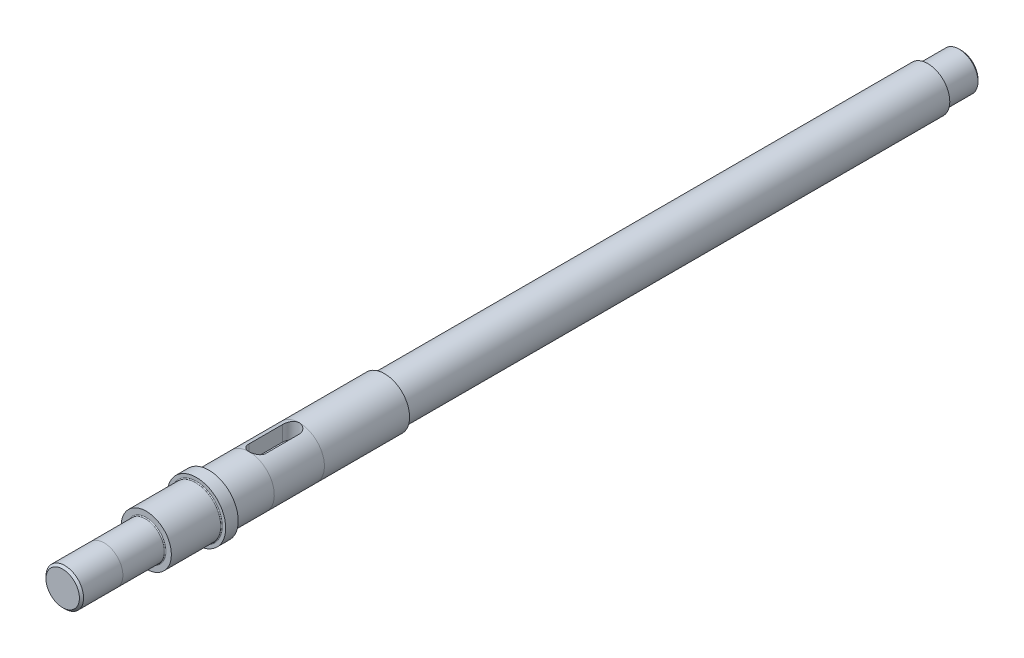
ISO-10303-21;
HEADER;
FILE_DESCRIPTION(('STEP AP214'),'2;1');
FILE_NAME('part.step','',(''),(''),'','','');
FILE_SCHEMA(('AUTOMOTIVE_DESIGN { 1 0 10303 214 1 1 1 1 }'));
ENDSEC;
DATA;
#1=APPLICATION_CONTEXT('core data for automotive mechanical design processes');
#2=APPLICATION_PROTOCOL_DEFINITION('international standard','automotive_design',2000,#1);
#3=PRODUCT_CONTEXT('',#1,'mechanical');
#4=PRODUCT('Part','Part','',(#3));
#5=PRODUCT_RELATED_PRODUCT_CATEGORY('part','',(#4));
#6=PRODUCT_DEFINITION_FORMATION('','',#4);
#7=PRODUCT_DEFINITION_CONTEXT('part definition',#1,'design');
#8=PRODUCT_DEFINITION('design','',#6,#7);
#9=PRODUCT_DEFINITION_SHAPE('','',#8);
#10=(LENGTH_UNIT() NAMED_UNIT(*) SI_UNIT(.MILLI.,.METRE.));
#11=(NAMED_UNIT(*) PLANE_ANGLE_UNIT() SI_UNIT($,.RADIAN.));
#12=(NAMED_UNIT(*) SI_UNIT($,.STERADIAN.) SOLID_ANGLE_UNIT());
#13=UNCERTAINTY_MEASURE_WITH_UNIT(LENGTH_MEASURE(1.E-05),#10,'distance_accuracy_value','');
#14=(GEOMETRIC_REPRESENTATION_CONTEXT(3) GLOBAL_UNCERTAINTY_ASSIGNED_CONTEXT((#13)) GLOBAL_UNIT_ASSIGNED_CONTEXT((#10,
#11,#12)) REPRESENTATION_CONTEXT('',''));
#15=CARTESIAN_POINT('',(0.,0.,0.));
#16=DIRECTION('',(0.,0.,1.));
#17=DIRECTION('',(1.,0.,0.));
#18=AXIS2_PLACEMENT_3D('',#15,#16,#17);
#19=CARTESIAN_POINT('',(0.,0.,172.));
#20=DIRECTION('',(0.,0.,-1.));
#21=DIRECTION('',(-1.,0.,0.));
#22=AXIS2_PLACEMENT_3D('',#19,#20,#21);
#23=CYLINDRICAL_SURFACE('',#22,6.);
#24=CARTESIAN_POINT('',(-2.,5.65685424949238,152.373495065648));
#25=CARTESIAN_POINT('',(-2.0000014949184,5.65684884188678,152.318914072045));
#26=CARTESIAN_POINT('',(-1.99776424917479,5.6576451988649,152.264360941269));
#27=CARTESIAN_POINT('',(-1.9888512140728,5.66078654578442,152.155677897538));
#28=CARTESIAN_POINT('',(-1.98217662286705,5.66313111768244,152.101547874328));
#29=CARTESIAN_POINT('',(-1.95562135046157,5.67238184449302,151.940710779257));
#30=CARTESIAN_POINT('',(-1.92920846605622,5.6815058499903,151.835133373107));
#31=CARTESIAN_POINT('',(-1.85991682366085,5.70456149397718,151.63024468076));
#32=CARTESIAN_POINT('',(-1.81704715197506,5.71849047905859,151.530929971902));
#33=CARTESIAN_POINT('',(-1.71614645792973,5.74957574438921,151.340815397637));
#34=CARTESIAN_POINT('',(-1.65810612564546,5.76673400456217,151.250020807513));
#35=CARTESIAN_POINT('',(-1.52610278704601,5.80308960804095,151.076054602999));
#36=CARTESIAN_POINT('',(-1.45164996064407,5.82233755536618,150.993265304722));
#37=CARTESIAN_POINT('',(-1.28997688598296,5.86027697385956,150.841083030064));
#38=CARTESIAN_POINT('',(-1.20275436910906,5.87896834543706,150.771692439136));
#39=CARTESIAN_POINT('',(-1.01520729191252,5.91427765988455,150.646536028039));
#40=CARTESIAN_POINT('',(-0.914600178716988,5.93082875123708,150.591173096843));
#41=CARTESIAN_POINT('',(-0.704858499931718,5.95939217209316,150.498310562273));
#42=CARTESIAN_POINT('',(-0.595726551186838,5.97140588786619,150.460805502007));
#43=CARTESIAN_POINT('',(-0.37605869095607,5.98918142285845,150.406023613465));
#44=CARTESIAN_POINT('',(-0.265703668920221,5.99514617977147,150.38808852054));
#45=CARTESIAN_POINT('',(-0.0433979389113438,6.00087216807634,150.370862468596));
#46=CARTESIAN_POINT('',(0.0685523824907875,6.00063487762605,150.371567067108));
#47=CARTESIAN_POINT('',(0.286207690558787,5.99412077270532,150.391183631861));
#48=CARTESIAN_POINT('',(0.391985405251075,5.98808121982527,150.409380341567));
#49=CARTESIAN_POINT('',(0.598888128753317,5.97093921001647,150.462281462996));
#50=CARTESIAN_POINT('',(0.700012879232936,5.95983647235462,150.49698679006));
#51=CARTESIAN_POINT('',(0.896305246061934,5.93351336542608,150.582337804849));
#52=CARTESIAN_POINT('',(0.991377011307994,5.91824075676625,150.633187155892));
#53=CARTESIAN_POINT('',(1.17184917819498,5.88516775360088,150.749214968429));
#54=CARTESIAN_POINT('',(1.25724693942937,5.86736667195186,150.814397327741));
#55=CARTESIAN_POINT('',(1.42019467942243,5.83012543885479,150.960837165641));
#56=CARTESIAN_POINT('',(1.4971872232254,5.81064757359828,151.042706152867));
#57=CARTESIAN_POINT('',(1.63654404964076,5.77294980945702,151.21837804508));
#58=CARTESIAN_POINT('',(1.69890360636762,5.75473031831507,151.312184790454));
#59=CARTESIAN_POINT('',(1.80800665118557,5.72140062752635,151.510855422354));
#60=CARTESIAN_POINT('',(1.85450601901537,5.70634029896469,151.615862095514));
#61=CARTESIAN_POINT('',(1.92892046140224,5.68162194124078,151.832789020828));
#62=CARTESIAN_POINT('',(1.95686487211072,5.67195538817986,151.944698052392));
#63=CARTESIAN_POINT('',(1.98331631256166,5.6627308418944,152.110332339144));
#64=CARTESIAN_POINT('',(1.98957012251023,5.66053335389204,152.162777845356));
#65=CARTESIAN_POINT('',(1.99790923214239,5.65759407142798,152.267971222447));
#66=CARTESIAN_POINT('',(1.99999991078996,5.65685039859056,152.320718614736));
#67=CARTESIAN_POINT('',(2.,5.65685424949238,152.373495065648));
#68=B_SPLINE_CURVE_WITH_KNOTS('',3,(#24,#25,#26,#27,#28,#29,#30,#31,#32,#33,#34,#35,#36,#37,#38,
#39,#40,#41,#42,#43,#44,#45,#46,#47,#48,#49,#50,#51,#52,#53,#54,#55,#56,#57,#58,#59,#60,#61,#62,
#63,#64,#65,#66,#67),.UNSPECIFIED.,.F.,.F.,(4,2,2,2,2,2,2,2,2,2,2,2,2,2,2,2,2,2,2,2,2,4),(0.,
0.163636969470881,0.327229772338919,0.653162396790756,0.978915321932496,1.30486862627063,
1.64233009925355,1.97985159727495,2.32618265866202,2.67240782242254,3.00658941454805,
3.34069136061284,3.6616883693147,3.98270317816495,4.30794037651935,4.63326613177537,
4.97388108116099,5.31460588498484,5.66036059856081,6.0055673497368,6.16399790665503,
6.32222363058112),.UNSPECIFIED.);
#69=CARTESIAN_POINT('',(-2.,5.65685424949238,152.373495065648));
#70=VERTEX_POINT('',#69);
#71=CARTESIAN_POINT('',(3.21989888200159E-13,6.00000000000107,150.373495065644));
#72=VERTEX_POINT('',#71);
#73=EDGE_CURVE('E153',#70,#72,#68,.T.);
#74=ORIENTED_EDGE('',*,*,#73,.T.);
#75=CARTESIAN_POINT('',(0.,0.,150.373495065648));
#76=DIRECTION('',(0.,0.,-1.));
#77=DIRECTION('',(-1.,0.,0.));
#78=AXIS2_PLACEMENT_3D('',#75,#76,#77);
#79=CIRCLE('',#78,6.);
#80=EDGE_CURVE('E61',#72,#72,#79,.T.);
#81=ORIENTED_EDGE('',*,*,#80,.F.);
#82=CARTESIAN_POINT('',(2.,5.65685424949238,152.373495065648));
#83=VERTEX_POINT('',#82);
#84=EDGE_CURVE('E152',#72,#83,#68,.T.);
#85=ORIENTED_EDGE('',*,*,#84,.T.);
#86=DIRECTION('',(0.,0.,-1.));
#87=VECTOR('',#86,1.);
#88=CARTESIAN_POINT('',(2.,5.65685424949238,172.));
#89=LINE('',#88,#87);
#90=CARTESIAN_POINT('',(2.,5.65685424949238,160.373495065648));
#91=VERTEX_POINT('',#90);
#92=EDGE_CURVE('E150',#83,#91,#89,.F.);
#93=ORIENTED_EDGE('',*,*,#92,.T.);
#94=CARTESIAN_POINT('',(2.,5.65685424949238,160.373495065648));
#95=CARTESIAN_POINT('',(2.0000014949184,5.65684884188678,160.42807605925));
#96=CARTESIAN_POINT('',(1.99776424917479,5.6576451988649,160.482629190026));
#97=CARTESIAN_POINT('',(1.9888512140728,5.66078654578442,160.591312233757));
#98=CARTESIAN_POINT('',(1.98217662286705,5.66313111768244,160.645442256967));
#99=CARTESIAN_POINT('',(1.95562135046157,5.67238184449302,160.806279352038));
#100=CARTESIAN_POINT('',(1.92920846605622,5.6815058499903,160.911856758189));
#101=CARTESIAN_POINT('',(1.85991682366085,5.70456149397718,161.116745450535));
#102=CARTESIAN_POINT('',(1.81704715197506,5.71849047905859,161.216060159394));
#103=CARTESIAN_POINT('',(1.71614645792973,5.74957574438922,161.406174733659));
#104=CARTESIAN_POINT('',(1.65810612564546,5.76673400456217,161.496969323782));
#105=CARTESIAN_POINT('',(1.52610278704601,5.80308960804095,161.670935528297));
#106=CARTESIAN_POINT('',(1.45164996064407,5.82233755536618,161.753724826573));
#107=CARTESIAN_POINT('',(1.28997688598296,5.86027697385956,161.905907101231));
#108=CARTESIAN_POINT('',(1.20275436910906,5.87896834543706,161.97529769216));
#109=CARTESIAN_POINT('',(1.01520729191251,5.91427765988455,162.100454103256));
#110=CARTESIAN_POINT('',(0.914600178716988,5.93082875123708,162.155817034452));
#111=CARTESIAN_POINT('',(0.704858499931719,5.95939217209317,162.248679569022));
#112=CARTESIAN_POINT('',(0.595726551186838,5.97140588786619,162.286184629289));
#113=CARTESIAN_POINT('',(0.376058690956069,5.98918142285845,162.34096651783));
#114=CARTESIAN_POINT('',(0.265703668920221,5.99514617977147,162.358901610755));
#115=CARTESIAN_POINT('',(0.0433979389113433,6.00087216807634,162.376127662699));
#116=CARTESIAN_POINT('',(-0.0685523824907881,6.00063487762605,162.375423064187));
#117=CARTESIAN_POINT('',(-0.286207690558788,5.99412077270532,162.355806499434));
#118=CARTESIAN_POINT('',(-0.391985405251076,5.98808121982527,162.337609789729));
#119=CARTESIAN_POINT('',(-0.598888128753317,5.97093921001647,162.284708668299));
#120=CARTESIAN_POINT('',(-0.700012879232936,5.95983647235462,162.250003341235));
#121=CARTESIAN_POINT('',(-0.896305246061935,5.93351336542608,162.164652326446));
#122=CARTESIAN_POINT('',(-0.991377011307994,5.91824075676625,162.113802975403));
#123=CARTESIAN_POINT('',(-1.17184917819498,5.88516775360088,161.997775162866));
#124=CARTESIAN_POINT('',(-1.25724693942937,5.86736667195186,161.932592803555));
#125=CARTESIAN_POINT('',(-1.42019467942243,5.83012543885479,161.786152965654));
#126=CARTESIAN_POINT('',(-1.4971872232254,5.81064757359828,161.704283978428));
#127=CARTESIAN_POINT('',(-1.63654404964077,5.77294980945703,161.528612086215));
#128=CARTESIAN_POINT('',(-1.69890360636762,5.75473031831507,161.434805340841));
#129=CARTESIAN_POINT('',(-1.80800665118556,5.72140062752635,161.236134708941));
#130=CARTESIAN_POINT('',(-1.85450601901536,5.70634029896469,161.131128035782));
#131=CARTESIAN_POINT('',(-1.92892046140223,5.68162194124078,160.914201110468));
#132=CARTESIAN_POINT('',(-1.95686487211072,5.67195538817986,160.802292078903));
#133=CARTESIAN_POINT('',(-1.98331631256166,5.6627308418944,160.636657792152));
#134=CARTESIAN_POINT('',(-1.98957012251024,5.66053335389204,160.584212285939));
#135=CARTESIAN_POINT('',(-1.9979092321424,5.65759407142798,160.479018908848));
#136=CARTESIAN_POINT('',(-1.99999991078996,5.65685039859056,160.426271516559));
#137=CARTESIAN_POINT('',(-2.,5.65685424949238,160.373495065648));
#138=B_SPLINE_CURVE_WITH_KNOTS('',3,(#94,#95,#96,#97,#98,#99,#100,#101,#102,#103,#104,#105,#106,
#107,#108,#109,#110,#111,#112,#113,#114,#115,#116,#117,#118,#119,#120,#121,#122,#123,#124,#125,
#126,#127,#128,#129,#130,#131,#132,#133,#134,#135,#136,#137),.UNSPECIFIED.,.F.,.F.,(4,2,2,2,2,2,
2,2,2,2,2,2,2,2,2,2,2,2,2,2,2,4),(0.,0.163636969470881,0.327229772338919,0.653162396790756,
0.978915321932496,1.30486862627063,1.64233009925357,1.97985159727496,2.32618265866202,
2.67240782242254,3.00658941454805,3.34069136061284,3.6616883693147,3.98270317816495,
4.30794037651935,4.63326613177537,4.97388108116099,5.31460588498484,5.66036059856076,
6.0055673497368,6.16399790665509,6.32222363058112),.UNSPECIFIED.);
#139=CARTESIAN_POINT('',(-3.21989888200159E-13,6.00000000000107,162.373495065651));
#140=VERTEX_POINT('',#139);
#141=EDGE_CURVE('E106',#91,#140,#138,.T.);
#142=ORIENTED_EDGE('',*,*,#141,.T.);
#143=CARTESIAN_POINT('',(0.,0.,162.373495065648));
#144=DIRECTION('',(0.,0.,-1.));
#145=DIRECTION('',(-1.,0.,0.));
#146=AXIS2_PLACEMENT_3D('',#143,#144,#145);
#147=CIRCLE('',#146,6.);
#148=EDGE_CURVE('E67',#140,#140,#147,.T.);
#149=ORIENTED_EDGE('',*,*,#148,.T.);
#150=CARTESIAN_POINT('',(-2.,5.65685424949238,160.373495065648));
#151=VERTEX_POINT('',#150);
#152=EDGE_CURVE('E186',#140,#151,#138,.T.);
#153=ORIENTED_EDGE('',*,*,#152,.T.);
#154=DIRECTION('',(0.,0.,-1.));
#155=VECTOR('',#154,1.);
#156=CARTESIAN_POINT('',(-2.,5.65685424949238,172.));
#157=LINE('',#156,#155);
#158=EDGE_CURVE('E160',#151,#70,#157,.T.);
#159=ORIENTED_EDGE('',*,*,#158,.T.);
#160=EDGE_LOOP('',(#74,#81,#85,#93,#142,#149,#153,#159));
#161=FACE_BOUND('',#160,.T.);
#162=ADVANCED_FACE('F46',(#161),#23,.T.);
#163=CARTESIAN_POINT('',(0.,0.,171.8));
#164=DIRECTION('',(0.,0.,1.));
#165=DIRECTION('',(1.,0.,0.));
#166=AXIS2_PLACEMENT_3D('',#163,#164,#165);
#167=CIRCLE('',#166,6.);
#168=CARTESIAN_POINT('',(6.,0.,171.8));
#169=VERTEX_POINT('',#168);
#170=EDGE_CURVE('E210',#169,#169,#167,.F.);
#171=ORIENTED_EDGE('',*,*,#170,.T.);
#172=EDGE_LOOP('',(#171));
#173=FACE_BOUND('',#172,.T.);
#174=ORIENTED_EDGE('',*,*,#148,.F.);
#175=EDGE_LOOP('',(#174));
#176=FACE_BOUND('',#175,.T.);
#177=ADVANCED_FACE('F244',(#173,#176),#23,.T.);
#178=CARTESIAN_POINT('',(0.,0.,195.));
#179=DIRECTION('',(0.,0.,-1.));
#180=DIRECTION('',(-1.,0.,0.));
#181=AXIS2_PLACEMENT_3D('',#178,#179,#180);
#182=CYLINDRICAL_SURFACE('',#181,4.5);
#183=CARTESIAN_POINT('',(0.,0.,206.5));
#184=DIRECTION('',(0.,0.,1.));
#185=DIRECTION('',(1.,0.,0.));
#186=AXIS2_PLACEMENT_3D('',#183,#184,#185);
#187=CIRCLE('',#186,4.5);
#188=CARTESIAN_POINT('',(4.5,0.,206.5));
#189=VERTEX_POINT('',#188);
#190=EDGE_CURVE('E12',#189,#189,#187,.F.);
#191=ORIENTED_EDGE('',*,*,#190,.T.);
#192=EDGE_LOOP('',(#191));
#193=FACE_BOUND('',#192,.T.);
#194=CARTESIAN_POINT('',(0.,0.,197.1));
#195=DIRECTION('',(0.,0.,-1.));
#196=DIRECTION('',(-1.,0.,0.));
#197=AXIS2_PLACEMENT_3D('',#194,#195,#196);
#198=CIRCLE('',#197,4.5);
#199=CARTESIAN_POINT('',(-4.5,0.,197.1));
#200=VERTEX_POINT('',#199);
#201=CARTESIAN_POINT('',(4.5,0.,197.1));
#202=VERTEX_POINT('',#201);
#203=EDGE_CURVE('E220',#200,#202,#198,.T.);
#204=ORIENTED_EDGE('',*,*,#203,.F.);
#205=EDGE_CURVE('E216',#202,#200,#198,.T.);
#206=ORIENTED_EDGE('',*,*,#205,.F.);
#207=EDGE_LOOP('',(#204,#206));
#208=FACE_BOUND('',#207,.T.);
#209=ADVANCED_FACE('F248',(#193,#208),#182,.T.);
#210=CARTESIAN_POINT('',(0.,0.,171.8));
#211=DIRECTION('',(0.,0.,1.));
#212=DIRECTION('',(1.,0.,0.));
#213=AXIS2_PLACEMENT_3D('',#210,#211,#212);
#214=TOROIDAL_SURFACE('',#213,6.2,0.2);
#215=ORIENTED_EDGE('',*,*,#170,.F.);
#216=EDGE_LOOP('',(#215));
#217=FACE_BOUND('',#216,.T.);
#218=CARTESIAN_POINT('',(0.,0.,172.));
#219=DIRECTION('',(0.,0.,1.));
#220=DIRECTION('',(1.,0.,0.));
#221=AXIS2_PLACEMENT_3D('',#218,#219,#220);
#222=CIRCLE('',#221,6.2);
#223=CARTESIAN_POINT('',(6.2,0.,172.));
#224=VERTEX_POINT('',#223);
#225=EDGE_CURVE('E213',#224,#224,#222,.T.);
#226=ORIENTED_EDGE('',*,*,#225,.F.);
#227=EDGE_LOOP('',(#226));
#228=FACE_BOUND('',#227,.T.);
#229=ADVANCED_FACE('F368',(#217,#228),#214,.F.);
#230=CARTESIAN_POINT('',(0.,0.,129.8));
#231=DIRECTION('',(0.,0.,1.));
#232=DIRECTION('',(1.,0.,0.));
#233=AXIS2_PLACEMENT_3D('',#230,#231,#232);
#234=TOROIDAL_SURFACE('',#233,5.45,0.2);
#235=CARTESIAN_POINT('',(0.,0.,130.));
#236=DIRECTION('',(0.,0.,1.));
#237=DIRECTION('',(1.,0.,0.));
#238=AXIS2_PLACEMENT_3D('',#235,#236,#237);
#239=CIRCLE('',#238,5.45);
#240=CARTESIAN_POINT('',(5.45,0.,130.));
#241=VERTEX_POINT('',#240);
#242=EDGE_CURVE('E204',#241,#241,#239,.T.);
#243=ORIENTED_EDGE('',*,*,#242,.F.);
#244=EDGE_LOOP('',(#243));
#245=FACE_BOUND('',#244,.T.);
#246=CARTESIAN_POINT('',(0.,0.,129.8));
#247=DIRECTION('',(0.,0.,1.));
#248=DIRECTION('',(1.,0.,0.));
#249=AXIS2_PLACEMENT_3D('',#246,#247,#248);
#250=CIRCLE('',#249,5.25);
#251=CARTESIAN_POINT('',(5.25,0.,129.8));
#252=VERTEX_POINT('',#251);
#253=EDGE_CURVE('E207',#252,#252,#250,.F.);
#254=ORIENTED_EDGE('',*,*,#253,.F.);
#255=EDGE_LOOP('',(#254));
#256=FACE_BOUND('',#255,.T.);
#257=ADVANCED_FACE('F373',(#245,#256),#234,.F.);
#258=CARTESIAN_POINT('',(0.,0.,187.2));
#259=DIRECTION('',(0.,0.,1.));
#260=DIRECTION('',(1.,0.,0.));
#261=AXIS2_PLACEMENT_3D('',#258,#259,#260);
#262=TOROIDAL_SURFACE('',#261,4.7,0.2);
#263=CARTESIAN_POINT('',(0.,0.,187.2));
#264=DIRECTION('',(0.,0.,1.));
#265=DIRECTION('',(1.,0.,0.));
#266=AXIS2_PLACEMENT_3D('',#263,#264,#265);
#267=CIRCLE('',#266,4.5);
#268=CARTESIAN_POINT('',(4.5,0.,187.2));
#269=VERTEX_POINT('',#268);
#270=EDGE_CURVE('E198',#269,#269,#267,.T.);
#271=ORIENTED_EDGE('',*,*,#270,.F.);
#272=EDGE_LOOP('',(#271));
#273=FACE_BOUND('',#272,.T.);
#274=CARTESIAN_POINT('',(0.,0.,187.));
#275=DIRECTION('',(0.,0.,1.));
#276=DIRECTION('',(1.,0.,0.));
#277=AXIS2_PLACEMENT_3D('',#274,#275,#276);
#278=CIRCLE('',#277,4.7);
#279=CARTESIAN_POINT('',(4.7,0.,187.));
#280=VERTEX_POINT('',#279);
#281=EDGE_CURVE('E201',#280,#280,#278,.F.);
#282=ORIENTED_EDGE('',*,*,#281,.F.);
#283=EDGE_LOOP('',(#282));
#284=FACE_BOUND('',#283,.T.);
#285=ADVANCED_FACE('F402',(#273,#284),#262,.F.);
#286=CARTESIAN_POINT('',(0.,0.,175.2));
#287=DIRECTION('',(0.,0.,1.));
#288=DIRECTION('',(1.,0.,0.));
#289=AXIS2_PLACEMENT_3D('',#286,#287,#288);
#290=TOROIDAL_SURFACE('',#289,6.2,0.2);
#291=CARTESIAN_POINT('',(0.,0.,175.));
#292=DIRECTION('',(0.,0.,1.));
#293=DIRECTION('',(1.,0.,0.));
#294=AXIS2_PLACEMENT_3D('',#291,#292,#293);
#295=CIRCLE('',#294,6.2);
#296=CARTESIAN_POINT('',(6.2,0.,175.));
#297=VERTEX_POINT('',#296);
#298=EDGE_CURVE('E192',#297,#297,#295,.F.);
#299=ORIENTED_EDGE('',*,*,#298,.F.);
#300=EDGE_LOOP('',(#299));
#301=FACE_BOUND('',#300,.T.);
#302=CARTESIAN_POINT('',(0.,0.,175.2));
#303=DIRECTION('',(0.,0.,1.));
#304=DIRECTION('',(1.,0.,0.));
#305=AXIS2_PLACEMENT_3D('',#302,#303,#304);
#306=CIRCLE('',#305,6.);
#307=CARTESIAN_POINT('',(6.,0.,175.2));
#308=VERTEX_POINT('',#307);
#309=EDGE_CURVE('E195',#308,#308,#306,.T.);
#310=ORIENTED_EDGE('',*,*,#309,.F.);
#311=EDGE_LOOP('',(#310));
#312=FACE_BOUND('',#311,.T.);
#313=ADVANCED_FACE('F421',(#301,#312),#290,.F.);
#314=CARTESIAN_POINT('',(0.,0.,-0.2));
#315=DIRECTION('',(0.,0.,1.));
#316=DIRECTION('',(1.,0.,0.));
#317=AXIS2_PLACEMENT_3D('',#314,#315,#316);
#318=TOROIDAL_SURFACE('',#317,4.7,0.2);
#319=CARTESIAN_POINT('',(0.,0.,0.));
#320=DIRECTION('',(0.,0.,1.));
#321=DIRECTION('',(1.,0.,0.));
#322=AXIS2_PLACEMENT_3D('',#319,#320,#321);
#323=CIRCLE('',#322,4.7);
#324=CARTESIAN_POINT('',(4.7,0.,0.));
#325=VERTEX_POINT('',#324);
#326=EDGE_CURVE('E185',#325,#325,#323,.T.);
#327=ORIENTED_EDGE('',*,*,#326,.F.);
#328=EDGE_LOOP('',(#327));
#329=FACE_BOUND('',#328,.T.);
#330=CARTESIAN_POINT('',(0.,0.,-0.2));
#331=DIRECTION('',(0.,0.,1.));
#332=DIRECTION('',(1.,0.,0.));
#333=AXIS2_PLACEMENT_3D('',#330,#331,#332);
#334=CIRCLE('',#333,4.5);
#335=CARTESIAN_POINT('',(4.5,0.,-0.2));
#336=VERTEX_POINT('',#335);
#337=EDGE_CURVE('E189',#336,#336,#334,.F.);
#338=ORIENTED_EDGE('',*,*,#337,.F.);
#339=EDGE_LOOP('',(#338));
#340=FACE_BOUND('',#339,.T.);
#341=ADVANCED_FACE('F395',(#329,#340),#318,.F.);
#342=CARTESIAN_POINT('',(0.,0.,130.));
#343=DIRECTION('',(0.,0.,-1.));
#344=DIRECTION('',(-1.,0.,0.));
#345=AXIS2_PLACEMENT_3D('',#342,#343,#344);
#346=CYLINDRICAL_SURFACE('',#345,5.25);
#347=ORIENTED_EDGE('',*,*,#253,.T.);
#348=EDGE_LOOP('',(#347));
#349=FACE_BOUND('',#348,.T.);
#350=CARTESIAN_POINT('',(0.,0.,0.));
#351=DIRECTION('',(0.,0.,1.));
#352=DIRECTION('',(1.,0.,0.));
#353=AXIS2_PLACEMENT_3D('',#350,#351,#352);
#354=CIRCLE('',#353,5.25);
#355=CARTESIAN_POINT('',(5.25,0.,0.));
#356=VERTEX_POINT('',#355);
#357=EDGE_CURVE('E147',#356,#356,#354,.T.);
#358=ORIENTED_EDGE('',*,*,#357,.T.);
#359=EDGE_LOOP('',(#358));
#360=FACE_BOUND('',#359,.T.);
#361=ADVANCED_FACE('F260',(#349,#360),#346,.T.);
#362=CARTESIAN_POINT('',(0.,0.,0.));
#363=DIRECTION('',(0.,0.,1.));
#364=DIRECTION('',(1.,0.,0.));
#365=AXIS2_PLACEMENT_3D('',#362,#363,#364);
#366=PLANE('',#365);
#367=ORIENTED_EDGE('',*,*,#326,.T.);
#368=EDGE_LOOP('',(#367));
#369=FACE_BOUND('',#368,.T.);
#370=ORIENTED_EDGE('',*,*,#357,.F.);
#371=EDGE_LOOP('',(#370));
#372=FACE_BOUND('',#371,.T.);
#373=ADVANCED_FACE('F252',(#369,#372),#366,.F.);
#374=ORIENTED_EDGE('',*,*,#80,.T.);
#375=EDGE_LOOP('',(#374));
#376=FACE_BOUND('',#375,.T.);
#377=CARTESIAN_POINT('',(0.,0.,130.));
#378=DIRECTION('',(0.,0.,1.));
#379=DIRECTION('',(1.,0.,0.));
#380=AXIS2_PLACEMENT_3D('',#377,#378,#379);
#381=CIRCLE('',#380,6.);
#382=CARTESIAN_POINT('',(6.,0.,130.));
#383=VERTEX_POINT('',#382);
#384=EDGE_CURVE('E141',#383,#383,#381,.T.);
#385=ORIENTED_EDGE('',*,*,#384,.T.);
#386=EDGE_LOOP('',(#385));
#387=FACE_BOUND('',#386,.T.);
#388=ADVANCED_FACE('F162',(#376,#387),#23,.T.);
#389=CARTESIAN_POINT('',(0.,0.,130.));
#390=DIRECTION('',(0.,0.,1.));
#391=DIRECTION('',(1.,0.,0.));
#392=AXIS2_PLACEMENT_3D('',#389,#390,#391);
#393=PLANE('',#392);
#394=ORIENTED_EDGE('',*,*,#242,.T.);
#395=EDGE_LOOP('',(#394));
#396=FACE_BOUND('',#395,.T.);
#397=ORIENTED_EDGE('',*,*,#384,.F.);
#398=EDGE_LOOP('',(#397));
#399=FACE_BOUND('',#398,.T.);
#400=ADVANCED_FACE('F251',(#396,#399),#393,.F.);
#401=CARTESIAN_POINT('',(0.,0.,175.));
#402=DIRECTION('',(0.,0.,-1.));
#403=DIRECTION('',(-1.,0.,0.));
#404=AXIS2_PLACEMENT_3D('',#401,#402,#403);
#405=CYLINDRICAL_SURFACE('',#404,7.);
#406=CARTESIAN_POINT('',(0.,0.,175.));
#407=DIRECTION('',(0.,0.,1.));
#408=DIRECTION('',(1.,0.,0.));
#409=AXIS2_PLACEMENT_3D('',#406,#407,#408);
#410=CIRCLE('',#409,7.);
#411=CARTESIAN_POINT('',(7.,0.,175.));
#412=VERTEX_POINT('',#411);
#413=EDGE_CURVE('E138',#412,#412,#410,.T.);
#414=ORIENTED_EDGE('',*,*,#413,.F.);
#415=EDGE_LOOP('',(#414));
#416=FACE_BOUND('',#415,.T.);
#417=CARTESIAN_POINT('',(0.,0.,172.));
#418=DIRECTION('',(0.,0.,1.));
#419=DIRECTION('',(1.,0.,0.));
#420=AXIS2_PLACEMENT_3D('',#417,#418,#419);
#421=CIRCLE('',#420,7.);
#422=CARTESIAN_POINT('',(7.,0.,172.));
#423=VERTEX_POINT('',#422);
#424=EDGE_CURVE('E137',#423,#423,#421,.T.);
#425=ORIENTED_EDGE('',*,*,#424,.T.);
#426=EDGE_LOOP('',(#425));
#427=FACE_BOUND('',#426,.T.);
#428=ADVANCED_FACE('F258',(#416,#427),#405,.T.);
#429=CARTESIAN_POINT('',(0.,0.,175.));
#430=DIRECTION('',(0.,0.,1.));
#431=DIRECTION('',(1.,0.,0.));
#432=AXIS2_PLACEMENT_3D('',#429,#430,#431);
#433=PLANE('',#432);
#434=ORIENTED_EDGE('',*,*,#298,.T.);
#435=EDGE_LOOP('',(#434));
#436=FACE_BOUND('',#435,.T.);
#437=ORIENTED_EDGE('',*,*,#413,.T.);
#438=EDGE_LOOP('',(#437));
#439=FACE_BOUND('',#438,.T.);
#440=ADVANCED_FACE('F358',(#436,#439),#433,.T.);
#441=CARTESIAN_POINT('',(0.,0.,172.));
#442=DIRECTION('',(0.,0.,1.));
#443=DIRECTION('',(1.,0.,0.));
#444=AXIS2_PLACEMENT_3D('',#441,#442,#443);
#445=PLANE('',#444);
#446=ORIENTED_EDGE('',*,*,#225,.T.);
#447=EDGE_LOOP('',(#446));
#448=FACE_BOUND('',#447,.T.);
#449=ORIENTED_EDGE('',*,*,#424,.F.);
#450=EDGE_LOOP('',(#449));
#451=FACE_BOUND('',#450,.T.);
#452=ADVANCED_FACE('F352',(#448,#451),#445,.F.);
#453=CARTESIAN_POINT('',(0.,0.,187.));
#454=DIRECTION('',(0.,0.,-1.));
#455=DIRECTION('',(-1.,0.,0.));
#456=AXIS2_PLACEMENT_3D('',#453,#454,#455);
#457=CYLINDRICAL_SURFACE('',#456,6.);
#458=ORIENTED_EDGE('',*,*,#309,.T.);
#459=EDGE_LOOP('',(#458));
#460=FACE_BOUND('',#459,.T.);
#461=CARTESIAN_POINT('',(0.,0.,187.));
#462=DIRECTION('',(0.,0.,1.));
#463=DIRECTION('',(1.,0.,0.));
#464=AXIS2_PLACEMENT_3D('',#461,#462,#463);
#465=CIRCLE('',#464,6.);
#466=CARTESIAN_POINT('',(6.,0.,187.));
#467=VERTEX_POINT('',#466);
#468=EDGE_CURVE('E130',#467,#467,#465,.T.);
#469=ORIENTED_EDGE('',*,*,#468,.F.);
#470=EDGE_LOOP('',(#469));
#471=FACE_BOUND('',#470,.T.);
#472=ADVANCED_FACE('F357',(#460,#471),#457,.T.);
#473=CARTESIAN_POINT('',(0.,0.,187.));
#474=DIRECTION('',(0.,0.,1.));
#475=DIRECTION('',(1.,0.,0.));
#476=AXIS2_PLACEMENT_3D('',#473,#474,#475);
#477=PLANE('',#476);
#478=ORIENTED_EDGE('',*,*,#281,.T.);
#479=EDGE_LOOP('',(#478));
#480=FACE_BOUND('',#479,.T.);
#481=ORIENTED_EDGE('',*,*,#468,.T.);
#482=EDGE_LOOP('',(#481));
#483=FACE_BOUND('',#482,.T.);
#484=ADVANCED_FACE('F345',(#480,#483),#477,.T.);
#485=ORIENTED_EDGE('',*,*,#205,.T.);
#486=ORIENTED_EDGE('',*,*,#203,.T.);
#487=EDGE_LOOP('',(#485,#486));
#488=FACE_BOUND('',#487,.T.);
#489=ORIENTED_EDGE('',*,*,#270,.T.);
#490=EDGE_LOOP('',(#489));
#491=FACE_BOUND('',#490,.T.);
#492=ADVANCED_FACE('F338',(#488,#491),#182,.T.);
#493=CARTESIAN_POINT('',(0.,0.,-8.));
#494=DIRECTION('',(0.,0.,1.));
#495=DIRECTION('',(1.,0.,0.));
#496=AXIS2_PLACEMENT_3D('',#493,#494,#495);
#497=CYLINDRICAL_SURFACE('',#496,4.5);
#498=CARTESIAN_POINT('',(0.,0.,-7.49999999999999));
#499=DIRECTION('',(0.,0.,-1.));
#500=DIRECTION('',(-1.,0.,0.));
#501=AXIS2_PLACEMENT_3D('',#498,#499,#500);
#502=CIRCLE('',#501,4.5);
#503=CARTESIAN_POINT('',(-4.5,0.,-7.49999999999999));
#504=VERTEX_POINT('',#503);
#505=EDGE_CURVE('E228',#504,#504,#502,.F.);
#506=ORIENTED_EDGE('',*,*,#505,.T.);
#507=EDGE_LOOP('',(#506));
#508=FACE_BOUND('',#507,.T.);
#509=ORIENTED_EDGE('',*,*,#337,.T.);
#510=EDGE_LOOP('',(#509));
#511=FACE_BOUND('',#510,.T.);
#512=ADVANCED_FACE('F344',(#508,#511),#497,.T.);
#513=CARTESIAN_POINT('',(0.,0.,-8.));
#514=DIRECTION('',(0.,0.,-1.));
#515=DIRECTION('',(-1.,0.,0.));
#516=AXIS2_PLACEMENT_3D('',#513,#514,#515);
#517=PLANE('',#516);
#518=CARTESIAN_POINT('',(0.,0.,-8.));
#519=DIRECTION('',(0.,0.,-1.));
#520=DIRECTION('',(-1.,0.,0.));
#521=AXIS2_PLACEMENT_3D('',#518,#519,#520);
#522=CIRCLE('',#521,4.);
#523=CARTESIAN_POINT('',(-4.,0.,-8.));
#524=VERTEX_POINT('',#523);
#525=EDGE_CURVE('E225',#524,#524,#522,.T.);
#526=ORIENTED_EDGE('',*,*,#525,.T.);
#527=EDGE_LOOP('',(#526));
#528=FACE_BOUND('',#527,.T.);
#529=ADVANCED_FACE('F179',(#528),#517,.T.);
#530=CARTESIAN_POINT('',(0.,2.,160.373495065648));
#531=DIRECTION('',(0.,1.,0.));
#532=DIRECTION('',(0.,0.,1.));
#533=AXIS2_PLACEMENT_3D('',#530,#531,#532);
#534=CYLINDRICAL_SURFACE('',#533,2.);
#535=DIRECTION('',(0.,1.,0.));
#536=VECTOR('',#535,1.);
#537=CARTESIAN_POINT('',(2.,2.,160.373495065648));
#538=LINE('',#537,#536);
#539=CARTESIAN_POINT('',(2.,2.,160.373495065648));
#540=VERTEX_POINT('',#539);
#541=EDGE_CURVE('E98',#540,#91,#538,.T.);
#542=ORIENTED_EDGE('',*,*,#541,.F.);
#543=CARTESIAN_POINT('',(0.,2.,160.373495065648));
#544=DIRECTION('',(0.,1.,0.));
#545=DIRECTION('',(0.,0.,1.));
#546=AXIS2_PLACEMENT_3D('',#543,#544,#545);
#547=CIRCLE('',#546,2.);
#548=CARTESIAN_POINT('',(-2.,2.,160.373495065648));
#549=VERTEX_POINT('',#548);
#550=EDGE_CURVE('E103',#549,#540,#547,.T.);
#551=ORIENTED_EDGE('',*,*,#550,.F.);
#552=DIRECTION('',(0.,1.,0.));
#553=VECTOR('',#552,1.);
#554=CARTESIAN_POINT('',(-2.,2.,160.373495065648));
#555=LINE('',#554,#553);
#556=EDGE_CURVE('E128',#549,#151,#555,.T.);
#557=ORIENTED_EDGE('',*,*,#556,.T.);
#558=ORIENTED_EDGE('',*,*,#152,.F.);
#559=ORIENTED_EDGE('',*,*,#141,.F.);
#560=EDGE_LOOP('',(#542,#551,#557,#558,#559));
#561=FACE_BOUND('',#560,.T.);
#562=ADVANCED_FACE('F100',(#561),#534,.F.);
#563=CARTESIAN_POINT('',(-2.,2.,160.373495065648));
#564=DIRECTION('',(-1.,0.,0.));
#565=DIRECTION('',(0.,0.,1.));
#566=AXIS2_PLACEMENT_3D('',#563,#564,#565);
#567=PLANE('',#566);
#568=ORIENTED_EDGE('',*,*,#556,.F.);
#569=DIRECTION('',(0.,0.,1.));
#570=VECTOR('',#569,1.);
#571=CARTESIAN_POINT('',(-2.,2.,160.373495065648));
#572=LINE('',#571,#570);
#573=CARTESIAN_POINT('',(-2.,2.,152.373495065648));
#574=VERTEX_POINT('',#573);
#575=EDGE_CURVE('E111',#574,#549,#572,.T.);
#576=ORIENTED_EDGE('',*,*,#575,.F.);
#577=DIRECTION('',(0.,1.,0.));
#578=VECTOR('',#577,1.);
#579=CARTESIAN_POINT('',(-2.,2.,152.373495065648));
#580=LINE('',#579,#578);
#581=EDGE_CURVE('E131',#574,#70,#580,.T.);
#582=ORIENTED_EDGE('',*,*,#581,.T.);
#583=ORIENTED_EDGE('',*,*,#158,.F.);
#584=EDGE_LOOP('',(#568,#576,#582,#583));
#585=FACE_BOUND('',#584,.T.);
#586=ADVANCED_FACE('F171',(#585),#567,.F.);
#587=CARTESIAN_POINT('',(0.,2.,152.373495065648));
#588=DIRECTION('',(0.,1.,0.));
#589=DIRECTION('',(0.,0.,1.));
#590=AXIS2_PLACEMENT_3D('',#587,#588,#589);
#591=CYLINDRICAL_SURFACE('',#590,2.);
#592=ORIENTED_EDGE('',*,*,#581,.F.);
#593=CARTESIAN_POINT('',(0.,2.,152.373495065648));
#594=DIRECTION('',(0.,1.,0.));
#595=DIRECTION('',(0.,0.,1.));
#596=AXIS2_PLACEMENT_3D('',#593,#594,#595);
#597=CIRCLE('',#596,2.);
#598=CARTESIAN_POINT('',(2.,2.,152.373495065648));
#599=VERTEX_POINT('',#598);
#600=EDGE_CURVE('E120',#599,#574,#597,.T.);
#601=ORIENTED_EDGE('',*,*,#600,.F.);
#602=DIRECTION('',(0.,1.,0.));
#603=VECTOR('',#602,1.);
#604=CARTESIAN_POINT('',(2.,2.,152.373495065648));
#605=LINE('',#604,#603);
#606=EDGE_CURVE('E110',#599,#83,#605,.T.);
#607=ORIENTED_EDGE('',*,*,#606,.T.);
#608=ORIENTED_EDGE('',*,*,#84,.F.);
#609=ORIENTED_EDGE('',*,*,#73,.F.);
#610=EDGE_LOOP('',(#592,#601,#607,#608,#609));
#611=FACE_BOUND('',#610,.T.);
#612=ADVANCED_FACE('F166',(#611),#591,.F.);
#613=CARTESIAN_POINT('',(2.,2.,160.373495065648));
#614=DIRECTION('',(1.,0.,0.));
#615=DIRECTION('',(0.,0.,-1.));
#616=AXIS2_PLACEMENT_3D('',#613,#614,#615);
#617=PLANE('',#616);
#618=ORIENTED_EDGE('',*,*,#606,.F.);
#619=DIRECTION('',(0.,0.,-1.));
#620=VECTOR('',#619,1.);
#621=CARTESIAN_POINT('',(2.,2.,160.373495065648));
#622=LINE('',#621,#620);
#623=EDGE_CURVE('E114',#540,#599,#622,.T.);
#624=ORIENTED_EDGE('',*,*,#623,.F.);
#625=ORIENTED_EDGE('',*,*,#541,.T.);
#626=ORIENTED_EDGE('',*,*,#92,.F.);
#627=EDGE_LOOP('',(#618,#624,#625,#626));
#628=FACE_BOUND('',#627,.T.);
#629=ADVANCED_FACE('F115',(#628),#617,.F.);
#630=CARTESIAN_POINT('',(0.,2.,160.373495065648));
#631=DIRECTION('',(0.,1.,0.));
#632=DIRECTION('',(0.,0.,1.));
#633=AXIS2_PLACEMENT_3D('',#630,#631,#632);
#634=PLANE('',#633);
#635=ORIENTED_EDGE('',*,*,#550,.T.);
#636=ORIENTED_EDGE('',*,*,#623,.T.);
#637=ORIENTED_EDGE('',*,*,#600,.T.);
#638=ORIENTED_EDGE('',*,*,#575,.T.);
#639=EDGE_LOOP('',(#635,#636,#637,#638));
#640=FACE_BOUND('',#639,.T.);
#641=ADVANCED_FACE('F122',(#640),#634,.T.);
#642=CARTESIAN_POINT('',(0.,0.,207.));
#643=DIRECTION('',(0.,0.,1.));
#644=DIRECTION('',(1.,0.,0.));
#645=AXIS2_PLACEMENT_3D('',#642,#643,#644);
#646=PLANE('',#645);
#647=CARTESIAN_POINT('',(0.,0.,207.));
#648=DIRECTION('',(0.,0.,1.));
#649=DIRECTION('',(1.,0.,0.));
#650=AXIS2_PLACEMENT_3D('',#647,#648,#649);
#651=CIRCLE('',#650,4.);
#652=CARTESIAN_POINT('',(4.,0.,207.));
#653=VERTEX_POINT('',#652);
#654=EDGE_CURVE('E54',#653,#653,#651,.T.);
#655=ORIENTED_EDGE('',*,*,#654,.T.);
#656=EDGE_LOOP('',(#655));
#657=FACE_BOUND('',#656,.T.);
#658=ADVANCED_FACE('F233',(#657),#646,.T.);
#659=CARTESIAN_POINT('',(0.,0.,-8.));
#660=DIRECTION('',(0.,0.,1.));
#661=DIRECTION('',(1.,0.,0.));
#662=AXIS2_PLACEMENT_3D('',#659,#660,#661);
#663=CONICAL_SURFACE('',#662,4.,0.785398163397433);
#664=ORIENTED_EDGE('',*,*,#505,.F.);
#665=EDGE_LOOP('',(#664));
#666=FACE_BOUND('',#665,.T.);
#667=ORIENTED_EDGE('',*,*,#525,.F.);
#668=EDGE_LOOP('',(#667));
#669=FACE_BOUND('',#668,.T.);
#670=ADVANCED_FACE('F236',(#666,#669),#663,.T.);
#671=CARTESIAN_POINT('',(0.,0.,207.));
#672=DIRECTION('',(0.,0.,-1.));
#673=DIRECTION('',(-1.,0.,0.));
#674=AXIS2_PLACEMENT_3D('',#671,#672,#673);
#675=CONICAL_SURFACE('',#674,4.,0.785398163397444);
#676=ORIENTED_EDGE('',*,*,#190,.F.);
#677=EDGE_LOOP('',(#676));
#678=FACE_BOUND('',#677,.T.);
#679=ORIENTED_EDGE('',*,*,#654,.F.);
#680=EDGE_LOOP('',(#679));
#681=FACE_BOUND('',#680,.T.);
#682=ADVANCED_FACE('F48',(#678,#681),#675,.T.);
#683=CLOSED_SHELL('',(#162,#177,#209,#229,#257,#285,#313,#341,#361,#373,#388,#400,#428,#440,
#452,#472,#484,#492,#512,#529,#562,#586,#612,#629,#641,#658,#670,#682));
#684=MANIFOLD_SOLID_BREP('B2',#683);
#685=ADVANCED_BREP_SHAPE_REPRESENTATION('',(#18,#684),#14);
#686=SHAPE_DEFINITION_REPRESENTATION(#9,#685);
ENDSEC;
END-ISO-10303-21;
